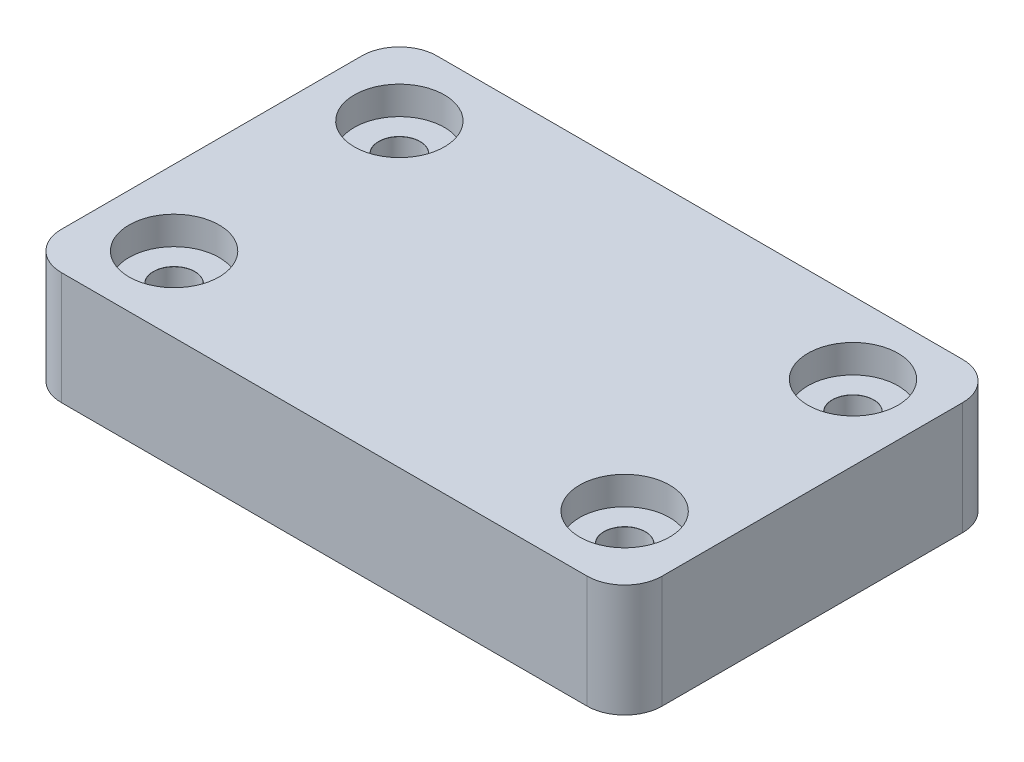
ISO-10303-21;
HEADER;
FILE_DESCRIPTION(('STEP AP214'),'2;1');
FILE_NAME('part.step','',(''),(''),'','','');
FILE_SCHEMA(('AUTOMOTIVE_DESIGN { 1 0 10303 214 1 1 1 1 }'));
ENDSEC;
DATA;
#1=APPLICATION_CONTEXT('core data for automotive mechanical design processes');
#2=APPLICATION_PROTOCOL_DEFINITION('international standard','automotive_design',2000,#1);
#3=PRODUCT_CONTEXT('',#1,'mechanical');
#4=PRODUCT('Part','Part','',(#3));
#5=PRODUCT_RELATED_PRODUCT_CATEGORY('part','',(#4));
#6=PRODUCT_DEFINITION_FORMATION('','',#4);
#7=PRODUCT_DEFINITION_CONTEXT('part definition',#1,'design');
#8=PRODUCT_DEFINITION('design','',#6,#7);
#9=PRODUCT_DEFINITION_SHAPE('','',#8);
#10=(LENGTH_UNIT() NAMED_UNIT(*) SI_UNIT(.MILLI.,.METRE.));
#11=(NAMED_UNIT(*) PLANE_ANGLE_UNIT() SI_UNIT($,.RADIAN.));
#12=(NAMED_UNIT(*) SI_UNIT($,.STERADIAN.) SOLID_ANGLE_UNIT());
#13=UNCERTAINTY_MEASURE_WITH_UNIT(LENGTH_MEASURE(1.E-05),#10,'distance_accuracy_value','');
#14=(GEOMETRIC_REPRESENTATION_CONTEXT(3) GLOBAL_UNCERTAINTY_ASSIGNED_CONTEXT((#13)) GLOBAL_UNIT_ASSIGNED_CONTEXT((#10,
#11,#12)) REPRESENTATION_CONTEXT('',''));
#15=CARTESIAN_POINT('',(0.,0.,0.));
#16=DIRECTION('',(0.,0.,1.));
#17=DIRECTION('',(1.,0.,0.));
#18=AXIS2_PLACEMENT_3D('',#15,#16,#17);
#19=CARTESIAN_POINT('',(-70.,30.,40.));
#20=DIRECTION('',(0.,-1.,0.));
#21=DIRECTION('',(0.,0.,-1.));
#22=AXIS2_PLACEMENT_3D('',#19,#20,#21);
#23=CYLINDRICAL_SURFACE('',#22,10.);
#24=CARTESIAN_POINT('',(-70.,0.,40.));
#25=DIRECTION('',(0.,1.,0.));
#26=DIRECTION('',(0.,0.,-1.));
#27=AXIS2_PLACEMENT_3D('',#24,#25,#26);
#28=CIRCLE('',#27,10.);
#29=CARTESIAN_POINT('',(-80.,0.,40.));
#30=VERTEX_POINT('',#29);
#31=CARTESIAN_POINT('',(-70.,0.,50.));
#32=VERTEX_POINT('',#31);
#33=EDGE_CURVE('E129',#30,#32,#28,.T.);
#34=ORIENTED_EDGE('',*,*,#33,.T.);
#35=DIRECTION('',(0.,-1.,0.));
#36=VECTOR('',#35,1.);
#37=CARTESIAN_POINT('',(-70.,30.,50.));
#38=LINE('',#37,#36);
#39=CARTESIAN_POINT('',(-70.,30.,50.));
#40=VERTEX_POINT('',#39);
#41=EDGE_CURVE('E11',#40,#32,#38,.T.);
#42=ORIENTED_EDGE('',*,*,#41,.F.);
#43=CARTESIAN_POINT('',(-70.,30.,40.));
#44=DIRECTION('',(0.,1.,0.));
#45=DIRECTION('',(0.,0.,-1.));
#46=AXIS2_PLACEMENT_3D('',#43,#44,#45);
#47=CIRCLE('',#46,10.);
#48=CARTESIAN_POINT('',(-80.,30.,40.));
#49=VERTEX_POINT('',#48);
#50=EDGE_CURVE('E144',#49,#40,#47,.T.);
#51=ORIENTED_EDGE('',*,*,#50,.F.);
#52=DIRECTION('',(0.,-1.,0.));
#53=VECTOR('',#52,1.);
#54=CARTESIAN_POINT('',(-80.,30.,40.));
#55=LINE('',#54,#53);
#56=EDGE_CURVE('E125',#49,#30,#55,.T.);
#57=ORIENTED_EDGE('',*,*,#56,.T.);
#58=EDGE_LOOP('',(#34,#42,#51,#57));
#59=FACE_BOUND('',#58,.T.);
#60=ADVANCED_FACE('F33',(#59),#23,.T.);
#61=CARTESIAN_POINT('',(-70.,30.,50.));
#62=DIRECTION('',(0.,0.,-1.));
#63=DIRECTION('',(-1.,0.,0.));
#64=AXIS2_PLACEMENT_3D('',#61,#62,#63);
#65=PLANE('',#64);
#66=DIRECTION('',(1.,0.,0.));
#67=VECTOR('',#66,1.);
#68=CARTESIAN_POINT('',(-70.,0.,50.));
#69=LINE('',#68,#67);
#70=CARTESIAN_POINT('',(70.,0.,50.));
#71=VERTEX_POINT('',#70);
#72=EDGE_CURVE('E132',#32,#71,#69,.T.);
#73=ORIENTED_EDGE('',*,*,#72,.T.);
#74=DIRECTION('',(0.,-1.,0.));
#75=VECTOR('',#74,1.);
#76=CARTESIAN_POINT('',(70.,30.,50.));
#77=LINE('',#76,#75);
#78=CARTESIAN_POINT('',(70.,30.,50.));
#79=VERTEX_POINT('',#78);
#80=EDGE_CURVE('E41',#79,#71,#77,.T.);
#81=ORIENTED_EDGE('',*,*,#80,.F.);
#82=DIRECTION('',(1.,0.,0.));
#83=VECTOR('',#82,1.);
#84=CARTESIAN_POINT('',(-70.,30.,50.));
#85=LINE('',#84,#83);
#86=EDGE_CURVE('E92',#40,#79,#85,.T.);
#87=ORIENTED_EDGE('',*,*,#86,.F.);
#88=ORIENTED_EDGE('',*,*,#41,.T.);
#89=EDGE_LOOP('',(#73,#81,#87,#88));
#90=FACE_BOUND('',#89,.T.);
#91=ADVANCED_FACE('F310',(#90),#65,.F.);
#92=CARTESIAN_POINT('',(70.,30.,40.));
#93=DIRECTION('',(0.,-1.,0.));
#94=DIRECTION('',(0.,0.,-1.));
#95=AXIS2_PLACEMENT_3D('',#92,#93,#94);
#96=CYLINDRICAL_SURFACE('',#95,10.);
#97=CARTESIAN_POINT('',(70.,0.,40.));
#98=DIRECTION('',(0.,1.,0.));
#99=DIRECTION('',(0.,0.,-1.));
#100=AXIS2_PLACEMENT_3D('',#97,#98,#99);
#101=CIRCLE('',#100,10.);
#102=CARTESIAN_POINT('',(80.,0.,40.));
#103=VERTEX_POINT('',#102);
#104=EDGE_CURVE('E135',#71,#103,#101,.T.);
#105=ORIENTED_EDGE('',*,*,#104,.T.);
#106=DIRECTION('',(0.,-1.,0.));
#107=VECTOR('',#106,1.);
#108=CARTESIAN_POINT('',(80.,30.,40.));
#109=LINE('',#108,#107);
#110=CARTESIAN_POINT('',(80.,30.,40.));
#111=VERTEX_POINT('',#110);
#112=EDGE_CURVE('E151',#111,#103,#109,.T.);
#113=ORIENTED_EDGE('',*,*,#112,.F.);
#114=CARTESIAN_POINT('',(70.,30.,40.));
#115=DIRECTION('',(0.,1.,0.));
#116=DIRECTION('',(0.,0.,-1.));
#117=AXIS2_PLACEMENT_3D('',#114,#115,#116);
#118=CIRCLE('',#117,10.);
#119=EDGE_CURVE('E159',#79,#111,#118,.T.);
#120=ORIENTED_EDGE('',*,*,#119,.F.);
#121=ORIENTED_EDGE('',*,*,#80,.T.);
#122=EDGE_LOOP('',(#105,#113,#120,#121));
#123=FACE_BOUND('',#122,.T.);
#124=ADVANCED_FACE('F157',(#123),#96,.T.);
#125=CARTESIAN_POINT('',(80.,30.,40.));
#126=DIRECTION('',(-1.,0.,0.));
#127=DIRECTION('',(0.,0.,1.));
#128=AXIS2_PLACEMENT_3D('',#125,#126,#127);
#129=PLANE('',#128);
#130=DIRECTION('',(0.,0.,-1.));
#131=VECTOR('',#130,1.);
#132=CARTESIAN_POINT('',(80.,0.,40.));
#133=LINE('',#132,#131);
#134=CARTESIAN_POINT('',(80.,0.,-40.));
#135=VERTEX_POINT('',#134);
#136=EDGE_CURVE('E137',#103,#135,#133,.T.);
#137=ORIENTED_EDGE('',*,*,#136,.T.);
#138=DIRECTION('',(0.,-1.,0.));
#139=VECTOR('',#138,1.);
#140=CARTESIAN_POINT('',(80.,30.,-40.));
#141=LINE('',#140,#139);
#142=CARTESIAN_POINT('',(80.,30.,-40.));
#143=VERTEX_POINT('',#142);
#144=EDGE_CURVE('E148',#143,#135,#141,.T.);
#145=ORIENTED_EDGE('',*,*,#144,.F.);
#146=DIRECTION('',(0.,0.,-1.));
#147=VECTOR('',#146,1.);
#148=CARTESIAN_POINT('',(80.,30.,40.));
#149=LINE('',#148,#147);
#150=EDGE_CURVE('E171',#111,#143,#149,.T.);
#151=ORIENTED_EDGE('',*,*,#150,.F.);
#152=ORIENTED_EDGE('',*,*,#112,.T.);
#153=EDGE_LOOP('',(#137,#145,#151,#152));
#154=FACE_BOUND('',#153,.T.);
#155=ADVANCED_FACE('F167',(#154),#129,.F.);
#156=CARTESIAN_POINT('',(70.,30.,-40.));
#157=DIRECTION('',(0.,-1.,0.));
#158=DIRECTION('',(0.,0.,-1.));
#159=AXIS2_PLACEMENT_3D('',#156,#157,#158);
#160=CYLINDRICAL_SURFACE('',#159,9.99999999999999);
#161=CARTESIAN_POINT('',(70.,0.,-40.));
#162=DIRECTION('',(0.,1.,0.));
#163=DIRECTION('',(0.,0.,-1.));
#164=AXIS2_PLACEMENT_3D('',#161,#162,#163);
#165=CIRCLE('',#164,9.99999999999999);
#166=CARTESIAN_POINT('',(70.,0.,-50.));
#167=VERTEX_POINT('',#166);
#168=EDGE_CURVE('E139',#135,#167,#165,.T.);
#169=ORIENTED_EDGE('',*,*,#168,.T.);
#170=DIRECTION('',(0.,-1.,0.));
#171=VECTOR('',#170,1.);
#172=CARTESIAN_POINT('',(70.,30.,-50.));
#173=LINE('',#172,#171);
#174=CARTESIAN_POINT('',(70.,30.,-50.));
#175=VERTEX_POINT('',#174);
#176=EDGE_CURVE('E120',#175,#167,#173,.T.);
#177=ORIENTED_EDGE('',*,*,#176,.F.);
#178=CARTESIAN_POINT('',(70.,30.,-40.));
#179=DIRECTION('',(0.,1.,0.));
#180=DIRECTION('',(0.,0.,-1.));
#181=AXIS2_PLACEMENT_3D('',#178,#179,#180);
#182=CIRCLE('',#181,9.99999999999999);
#183=EDGE_CURVE('E111',#143,#175,#182,.T.);
#184=ORIENTED_EDGE('',*,*,#183,.F.);
#185=ORIENTED_EDGE('',*,*,#144,.T.);
#186=EDGE_LOOP('',(#169,#177,#184,#185));
#187=FACE_BOUND('',#186,.T.);
#188=ADVANCED_FACE('F170',(#187),#160,.T.);
#189=CARTESIAN_POINT('',(-70.,30.,-50.));
#190=DIRECTION('',(0.,0.,1.));
#191=DIRECTION('',(1.,0.,0.));
#192=AXIS2_PLACEMENT_3D('',#189,#190,#191);
#193=PLANE('',#192);
#194=DIRECTION('',(-1.,0.,0.));
#195=VECTOR('',#194,1.);
#196=CARTESIAN_POINT('',(-70.,0.,-50.));
#197=LINE('',#196,#195);
#198=CARTESIAN_POINT('',(-70.,0.,-50.));
#199=VERTEX_POINT('',#198);
#200=EDGE_CURVE('E119',#167,#199,#197,.T.);
#201=ORIENTED_EDGE('',*,*,#200,.T.);
#202=DIRECTION('',(0.,-1.,0.));
#203=VECTOR('',#202,1.);
#204=CARTESIAN_POINT('',(-70.,30.,-50.));
#205=LINE('',#204,#203);
#206=CARTESIAN_POINT('',(-70.,30.,-50.));
#207=VERTEX_POINT('',#206);
#208=EDGE_CURVE('E116',#207,#199,#205,.T.);
#209=ORIENTED_EDGE('',*,*,#208,.F.);
#210=DIRECTION('',(-1.,0.,0.));
#211=VECTOR('',#210,1.);
#212=CARTESIAN_POINT('',(-70.,30.,-50.));
#213=LINE('',#212,#211);
#214=EDGE_CURVE('E105',#175,#207,#213,.T.);
#215=ORIENTED_EDGE('',*,*,#214,.F.);
#216=ORIENTED_EDGE('',*,*,#176,.T.);
#217=EDGE_LOOP('',(#201,#209,#215,#216));
#218=FACE_BOUND('',#217,.T.);
#219=ADVANCED_FACE('F117',(#218),#193,.F.);
#220=CARTESIAN_POINT('',(-70.,30.,-40.));
#221=DIRECTION('',(0.,-1.,0.));
#222=DIRECTION('',(0.,0.,-1.));
#223=AXIS2_PLACEMENT_3D('',#220,#221,#222);
#224=CYLINDRICAL_SURFACE('',#223,10.);
#225=CARTESIAN_POINT('',(-70.,0.,-40.));
#226=DIRECTION('',(0.,1.,0.));
#227=DIRECTION('',(0.,0.,-1.));
#228=AXIS2_PLACEMENT_3D('',#225,#226,#227);
#229=CIRCLE('',#228,10.);
#230=CARTESIAN_POINT('',(-80.,0.,-40.));
#231=VERTEX_POINT('',#230);
#232=EDGE_CURVE('E78',#199,#231,#229,.T.);
#233=ORIENTED_EDGE('',*,*,#232,.T.);
#234=DIRECTION('',(0.,-1.,0.));
#235=VECTOR('',#234,1.);
#236=CARTESIAN_POINT('',(-80.,30.,-40.));
#237=LINE('',#236,#235);
#238=CARTESIAN_POINT('',(-80.,30.,-40.));
#239=VERTEX_POINT('',#238);
#240=EDGE_CURVE('E121',#239,#231,#237,.T.);
#241=ORIENTED_EDGE('',*,*,#240,.F.);
#242=CARTESIAN_POINT('',(-70.,30.,-40.));
#243=DIRECTION('',(0.,1.,0.));
#244=DIRECTION('',(0.,0.,-1.));
#245=AXIS2_PLACEMENT_3D('',#242,#243,#244);
#246=CIRCLE('',#245,10.);
#247=EDGE_CURVE('E109',#207,#239,#246,.T.);
#248=ORIENTED_EDGE('',*,*,#247,.F.);
#249=ORIENTED_EDGE('',*,*,#208,.T.);
#250=EDGE_LOOP('',(#233,#241,#248,#249));
#251=FACE_BOUND('',#250,.T.);
#252=ADVANCED_FACE('F123',(#251),#224,.T.);
#253=CARTESIAN_POINT('',(-80.,30.,40.));
#254=DIRECTION('',(1.,0.,0.));
#255=DIRECTION('',(0.,0.,-1.));
#256=AXIS2_PLACEMENT_3D('',#253,#254,#255);
#257=PLANE('',#256);
#258=DIRECTION('',(0.,0.,1.));
#259=VECTOR('',#258,1.);
#260=CARTESIAN_POINT('',(-80.,0.,40.));
#261=LINE('',#260,#259);
#262=EDGE_CURVE('E84',#231,#30,#261,.T.);
#263=ORIENTED_EDGE('',*,*,#262,.T.);
#264=ORIENTED_EDGE('',*,*,#56,.F.);
#265=DIRECTION('',(0.,0.,1.));
#266=VECTOR('',#265,1.);
#267=CARTESIAN_POINT('',(-80.,30.,40.));
#268=LINE('',#267,#266);
#269=EDGE_CURVE('E49',#239,#49,#268,.T.);
#270=ORIENTED_EDGE('',*,*,#269,.F.);
#271=ORIENTED_EDGE('',*,*,#240,.T.);
#272=EDGE_LOOP('',(#263,#264,#270,#271));
#273=FACE_BOUND('',#272,.T.);
#274=ADVANCED_FACE('F284',(#273),#257,.F.);
#275=CARTESIAN_POINT('',(-70.,30.,40.));
#276=DIRECTION('',(0.,-1.,0.));
#277=DIRECTION('',(0.,0.,-1.));
#278=AXIS2_PLACEMENT_3D('',#275,#276,#277);
#279=PLANE('',#278);
#280=CARTESIAN_POINT('',(-60.,30.,-30.));
#281=DIRECTION('',(0.,1.,0.));
#282=DIRECTION('',(0.,0.,1.));
#283=AXIS2_PLACEMENT_3D('',#280,#281,#282);
#284=CIRCLE('',#283,12.);
#285=CARTESIAN_POINT('',(-60.,30.,-18.));
#286=VERTEX_POINT('',#285);
#287=EDGE_CURVE('E242',#286,#286,#284,.T.);
#288=ORIENTED_EDGE('',*,*,#287,.F.);
#289=EDGE_LOOP('',(#288));
#290=FACE_BOUND('',#289,.T.);
#291=CARTESIAN_POINT('',(60.,30.,-30.8173689432465));
#292=DIRECTION('',(0.,1.,0.));
#293=DIRECTION('',(0.,0.,1.));
#294=AXIS2_PLACEMENT_3D('',#291,#292,#293);
#295=CIRCLE('',#294,12.);
#296=CARTESIAN_POINT('',(60.,30.,-18.8173689432465));
#297=VERTEX_POINT('',#296);
#298=EDGE_CURVE('E224',#297,#297,#295,.T.);
#299=ORIENTED_EDGE('',*,*,#298,.F.);
#300=EDGE_LOOP('',(#299));
#301=FACE_BOUND('',#300,.T.);
#302=CARTESIAN_POINT('',(-60.,30.,30.));
#303=DIRECTION('',(0.,1.,0.));
#304=DIRECTION('',(0.,0.,1.));
#305=AXIS2_PLACEMENT_3D('',#302,#303,#304);
#306=CIRCLE('',#305,12.);
#307=CARTESIAN_POINT('',(-60.,30.,42.));
#308=VERTEX_POINT('',#307);
#309=EDGE_CURVE('E206',#308,#308,#306,.T.);
#310=ORIENTED_EDGE('',*,*,#309,.F.);
#311=EDGE_LOOP('',(#310));
#312=FACE_BOUND('',#311,.T.);
#313=CARTESIAN_POINT('',(60.,30.,30.));
#314=DIRECTION('',(0.,1.,0.));
#315=DIRECTION('',(0.,0.,1.));
#316=AXIS2_PLACEMENT_3D('',#313,#314,#315);
#317=CIRCLE('',#316,12.);
#318=CARTESIAN_POINT('',(60.,30.,42.));
#319=VERTEX_POINT('',#318);
#320=EDGE_CURVE('E188',#319,#319,#317,.T.);
#321=ORIENTED_EDGE('',*,*,#320,.F.);
#322=EDGE_LOOP('',(#321));
#323=FACE_BOUND('',#322,.T.);
#324=ORIENTED_EDGE('',*,*,#50,.T.);
#325=ORIENTED_EDGE('',*,*,#86,.T.);
#326=ORIENTED_EDGE('',*,*,#119,.T.);
#327=ORIENTED_EDGE('',*,*,#150,.T.);
#328=ORIENTED_EDGE('',*,*,#183,.T.);
#329=ORIENTED_EDGE('',*,*,#214,.T.);
#330=ORIENTED_EDGE('',*,*,#247,.T.);
#331=ORIENTED_EDGE('',*,*,#269,.T.);
#332=EDGE_LOOP('',(#324,#325,#326,#327,#328,#329,#330,#331));
#333=FACE_BOUND('',#332,.T.);
#334=ADVANCED_FACE('F107',(#290,#301,#312,#323,#333),#279,.F.);
#335=CARTESIAN_POINT('',(-70.,0.,40.));
#336=DIRECTION('',(0.,-1.,0.));
#337=DIRECTION('',(0.,0.,-1.));
#338=AXIS2_PLACEMENT_3D('',#335,#336,#337);
#339=PLANE('',#338);
#340=CARTESIAN_POINT('',(-60.,0.,-30.));
#341=DIRECTION('',(0.,1.,0.));
#342=DIRECTION('',(0.,0.,1.));
#343=AXIS2_PLACEMENT_3D('',#340,#341,#342);
#344=CIRCLE('',#343,5.525);
#345=CARTESIAN_POINT('',(-60.,0.,-24.475));
#346=VERTEX_POINT('',#345);
#347=EDGE_CURVE('E245',#346,#346,#344,.T.);
#348=ORIENTED_EDGE('',*,*,#347,.T.);
#349=EDGE_LOOP('',(#348));
#350=FACE_BOUND('',#349,.T.);
#351=CARTESIAN_POINT('',(60.,0.,-30.8173689432465));
#352=DIRECTION('',(0.,1.,0.));
#353=DIRECTION('',(0.,0.,1.));
#354=AXIS2_PLACEMENT_3D('',#351,#352,#353);
#355=CIRCLE('',#354,5.52499999999999);
#356=CARTESIAN_POINT('',(60.,0.,-25.2923689432465));
#357=VERTEX_POINT('',#356);
#358=EDGE_CURVE('E227',#357,#357,#355,.T.);
#359=ORIENTED_EDGE('',*,*,#358,.T.);
#360=EDGE_LOOP('',(#359));
#361=FACE_BOUND('',#360,.T.);
#362=CARTESIAN_POINT('',(-60.,0.,30.));
#363=DIRECTION('',(0.,1.,0.));
#364=DIRECTION('',(0.,0.,1.));
#365=AXIS2_PLACEMENT_3D('',#362,#363,#364);
#366=CIRCLE('',#365,5.525);
#367=CARTESIAN_POINT('',(-60.,0.,35.525));
#368=VERTEX_POINT('',#367);
#369=EDGE_CURVE('E209',#368,#368,#366,.T.);
#370=ORIENTED_EDGE('',*,*,#369,.T.);
#371=EDGE_LOOP('',(#370));
#372=FACE_BOUND('',#371,.T.);
#373=CARTESIAN_POINT('',(60.,0.,30.));
#374=DIRECTION('',(0.,1.,0.));
#375=DIRECTION('',(0.,0.,1.));
#376=AXIS2_PLACEMENT_3D('',#373,#374,#375);
#377=CIRCLE('',#376,5.525);
#378=CARTESIAN_POINT('',(60.,0.,35.525));
#379=VERTEX_POINT('',#378);
#380=EDGE_CURVE('E191',#379,#379,#377,.T.);
#381=ORIENTED_EDGE('',*,*,#380,.T.);
#382=EDGE_LOOP('',(#381));
#383=FACE_BOUND('',#382,.T.);
#384=ORIENTED_EDGE('',*,*,#33,.F.);
#385=ORIENTED_EDGE('',*,*,#262,.F.);
#386=ORIENTED_EDGE('',*,*,#232,.F.);
#387=ORIENTED_EDGE('',*,*,#200,.F.);
#388=ORIENTED_EDGE('',*,*,#168,.F.);
#389=ORIENTED_EDGE('',*,*,#136,.F.);
#390=ORIENTED_EDGE('',*,*,#104,.F.);
#391=ORIENTED_EDGE('',*,*,#72,.F.);
#392=EDGE_LOOP('',(#384,#385,#386,#387,#388,#389,#390,#391));
#393=FACE_BOUND('',#392,.T.);
#394=ADVANCED_FACE('F163',(#350,#361,#372,#383,#393),#339,.T.);
#395=CARTESIAN_POINT('',(60.,0.0250000000000007,30.));
#396=DIRECTION('',(0.,-1.,0.));
#397=DIRECTION('',(0.,0.,-1.));
#398=AXIS2_PLACEMENT_3D('',#395,#396,#397);
#399=CONICAL_SURFACE('',#398,5.5,0.785398163397379);
#400=ORIENTED_EDGE('',*,*,#380,.F.);
#401=EDGE_LOOP('',(#400));
#402=FACE_BOUND('',#401,.T.);
#403=CARTESIAN_POINT('',(60.,0.0250000000000007,30.));
#404=DIRECTION('',(0.,1.,0.));
#405=DIRECTION('',(0.,0.,1.));
#406=AXIS2_PLACEMENT_3D('',#403,#404,#405);
#407=CIRCLE('',#406,5.5);
#408=CARTESIAN_POINT('',(60.,0.0250000000000007,35.5));
#409=VERTEX_POINT('',#408);
#410=EDGE_CURVE('E133',#409,#409,#407,.T.);
#411=ORIENTED_EDGE('',*,*,#410,.T.);
#412=EDGE_LOOP('',(#411));
#413=FACE_BOUND('',#412,.T.);
#414=ADVANCED_FACE('F371',(#402,#413),#399,.F.);
#415=CARTESIAN_POINT('',(60.,30.,30.));
#416=DIRECTION('',(0.,1.,0.));
#417=DIRECTION('',(0.,0.,1.));
#418=AXIS2_PLACEMENT_3D('',#415,#416,#417);
#419=CYLINDRICAL_SURFACE('',#418,5.5);
#420=ORIENTED_EDGE('',*,*,#410,.F.);
#421=EDGE_LOOP('',(#420));
#422=FACE_BOUND('',#421,.T.);
#423=CARTESIAN_POINT('',(60.,22.475,30.));
#424=DIRECTION('',(0.,1.,0.));
#425=DIRECTION('',(0.,0.,1.));
#426=AXIS2_PLACEMENT_3D('',#423,#424,#425);
#427=CIRCLE('',#426,5.5);
#428=CARTESIAN_POINT('',(60.,22.475,35.5));
#429=VERTEX_POINT('',#428);
#430=EDGE_CURVE('E179',#429,#429,#427,.T.);
#431=ORIENTED_EDGE('',*,*,#430,.T.);
#432=EDGE_LOOP('',(#431));
#433=FACE_BOUND('',#432,.T.);
#434=ADVANCED_FACE('F379',(#422,#433),#419,.F.);
#435=CARTESIAN_POINT('',(60.,22.5,30.));
#436=DIRECTION('',(0.,1.,0.));
#437=DIRECTION('',(0.,0.,1.));
#438=AXIS2_PLACEMENT_3D('',#435,#436,#437);
#439=CONICAL_SURFACE('',#438,5.525,0.785398163397448);
#440=ORIENTED_EDGE('',*,*,#430,.F.);
#441=EDGE_LOOP('',(#440));
#442=FACE_BOUND('',#441,.T.);
#443=CARTESIAN_POINT('',(60.,22.5,30.));
#444=DIRECTION('',(0.,1.,0.));
#445=DIRECTION('',(0.,0.,1.));
#446=AXIS2_PLACEMENT_3D('',#443,#444,#445);
#447=CIRCLE('',#446,5.525);
#448=CARTESIAN_POINT('',(60.,22.5,35.525));
#449=VERTEX_POINT('',#448);
#450=EDGE_CURVE('E182',#449,#449,#447,.T.);
#451=ORIENTED_EDGE('',*,*,#450,.T.);
#452=EDGE_LOOP('',(#451));
#453=FACE_BOUND('',#452,.T.);
#454=ADVANCED_FACE('F305',(#442,#453),#439,.F.);
#455=CARTESIAN_POINT('',(65.525,22.5,30.));
#456=DIRECTION('',(0.,-1.,0.));
#457=DIRECTION('',(0.,0.,-1.));
#458=AXIS2_PLACEMENT_3D('',#455,#456,#457);
#459=PLANE('',#458);
#460=ORIENTED_EDGE('',*,*,#450,.F.);
#461=EDGE_LOOP('',(#460));
#462=FACE_BOUND('',#461,.T.);
#463=CARTESIAN_POINT('',(60.,22.5,30.));
#464=DIRECTION('',(0.,1.,0.));
#465=DIRECTION('',(0.,0.,1.));
#466=AXIS2_PLACEMENT_3D('',#463,#464,#465);
#467=CIRCLE('',#466,12.);
#468=CARTESIAN_POINT('',(60.,22.5,42.));
#469=VERTEX_POINT('',#468);
#470=EDGE_CURVE('E185',#469,#469,#467,.T.);
#471=ORIENTED_EDGE('',*,*,#470,.T.);
#472=EDGE_LOOP('',(#471));
#473=FACE_BOUND('',#472,.T.);
#474=ADVANCED_FACE('F295',(#462,#473),#459,.F.);
#475=CARTESIAN_POINT('',(60.,30.,30.));
#476=DIRECTION('',(0.,1.,0.));
#477=DIRECTION('',(0.,0.,1.));
#478=AXIS2_PLACEMENT_3D('',#475,#476,#477);
#479=CYLINDRICAL_SURFACE('',#478,12.);
#480=ORIENTED_EDGE('',*,*,#470,.F.);
#481=EDGE_LOOP('',(#480));
#482=FACE_BOUND('',#481,.T.);
#483=ORIENTED_EDGE('',*,*,#320,.T.);
#484=EDGE_LOOP('',(#483));
#485=FACE_BOUND('',#484,.T.);
#486=ADVANCED_FACE('F292',(#482,#485),#479,.F.);
#487=CARTESIAN_POINT('',(-60.,0.0250000000000007,30.));
#488=DIRECTION('',(0.,-1.,0.));
#489=DIRECTION('',(0.,0.,-1.));
#490=AXIS2_PLACEMENT_3D('',#487,#488,#489);
#491=CONICAL_SURFACE('',#490,5.49999999999999,0.785398163397518);
#492=ORIENTED_EDGE('',*,*,#369,.F.);
#493=EDGE_LOOP('',(#492));
#494=FACE_BOUND('',#493,.T.);
#495=CARTESIAN_POINT('',(-60.,0.0250000000000007,30.));
#496=DIRECTION('',(0.,1.,0.));
#497=DIRECTION('',(0.,0.,1.));
#498=AXIS2_PLACEMENT_3D('',#495,#496,#497);
#499=CIRCLE('',#498,5.49999999999999);
#500=CARTESIAN_POINT('',(-60.,0.0250000000000007,35.5));
#501=VERTEX_POINT('',#500);
#502=EDGE_CURVE('E194',#501,#501,#499,.T.);
#503=ORIENTED_EDGE('',*,*,#502,.T.);
#504=EDGE_LOOP('',(#503));
#505=FACE_BOUND('',#504,.T.);
#506=ADVANCED_FACE('F294',(#494,#505),#491,.F.);
#507=CARTESIAN_POINT('',(-60.,30.,30.));
#508=DIRECTION('',(0.,1.,0.));
#509=DIRECTION('',(0.,0.,1.));
#510=AXIS2_PLACEMENT_3D('',#507,#508,#509);
#511=CYLINDRICAL_SURFACE('',#510,5.49999999999999);
#512=ORIENTED_EDGE('',*,*,#502,.F.);
#513=EDGE_LOOP('',(#512));
#514=FACE_BOUND('',#513,.T.);
#515=CARTESIAN_POINT('',(-60.,22.475,30.));
#516=DIRECTION('',(0.,1.,0.));
#517=DIRECTION('',(0.,0.,1.));
#518=AXIS2_PLACEMENT_3D('',#515,#516,#517);
#519=CIRCLE('',#518,5.5);
#520=CARTESIAN_POINT('',(-60.,22.475,35.5));
#521=VERTEX_POINT('',#520);
#522=EDGE_CURVE('E197',#521,#521,#519,.T.);
#523=ORIENTED_EDGE('',*,*,#522,.T.);
#524=EDGE_LOOP('',(#523));
#525=FACE_BOUND('',#524,.T.);
#526=ADVANCED_FACE('F302',(#514,#525),#511,.F.);
#527=CARTESIAN_POINT('',(-60.,22.5,30.));
#528=DIRECTION('',(0.,1.,0.));
#529=DIRECTION('',(0.,0.,1.));
#530=AXIS2_PLACEMENT_3D('',#527,#528,#529);
#531=CONICAL_SURFACE('',#530,5.525,0.785398163397448);
#532=ORIENTED_EDGE('',*,*,#522,.F.);
#533=EDGE_LOOP('',(#532));
#534=FACE_BOUND('',#533,.T.);
#535=CARTESIAN_POINT('',(-60.,22.5,30.));
#536=DIRECTION('',(0.,1.,0.));
#537=DIRECTION('',(0.,0.,1.));
#538=AXIS2_PLACEMENT_3D('',#535,#536,#537);
#539=CIRCLE('',#538,5.525);
#540=CARTESIAN_POINT('',(-60.,22.5,35.525));
#541=VERTEX_POINT('',#540);
#542=EDGE_CURVE('E200',#541,#541,#539,.T.);
#543=ORIENTED_EDGE('',*,*,#542,.T.);
#544=EDGE_LOOP('',(#543));
#545=FACE_BOUND('',#544,.T.);
#546=ADVANCED_FACE('F423',(#534,#545),#531,.F.);
#547=CARTESIAN_POINT('',(-54.475,22.5,30.));
#548=DIRECTION('',(0.,-1.,0.));
#549=DIRECTION('',(0.,0.,-1.));
#550=AXIS2_PLACEMENT_3D('',#547,#548,#549);
#551=PLANE('',#550);
#552=ORIENTED_EDGE('',*,*,#542,.F.);
#553=EDGE_LOOP('',(#552));
#554=FACE_BOUND('',#553,.T.);
#555=CARTESIAN_POINT('',(-60.,22.5,30.));
#556=DIRECTION('',(0.,1.,0.));
#557=DIRECTION('',(0.,0.,1.));
#558=AXIS2_PLACEMENT_3D('',#555,#556,#557);
#559=CIRCLE('',#558,12.);
#560=CARTESIAN_POINT('',(-60.,22.5,42.));
#561=VERTEX_POINT('',#560);
#562=EDGE_CURVE('E203',#561,#561,#559,.T.);
#563=ORIENTED_EDGE('',*,*,#562,.T.);
#564=EDGE_LOOP('',(#563));
#565=FACE_BOUND('',#564,.T.);
#566=ADVANCED_FACE('F433',(#554,#565),#551,.F.);
#567=CARTESIAN_POINT('',(-60.,30.,30.));
#568=DIRECTION('',(0.,1.,0.));
#569=DIRECTION('',(0.,0.,1.));
#570=AXIS2_PLACEMENT_3D('',#567,#568,#569);
#571=CYLINDRICAL_SURFACE('',#570,12.);
#572=ORIENTED_EDGE('',*,*,#562,.F.);
#573=EDGE_LOOP('',(#572));
#574=FACE_BOUND('',#573,.T.);
#575=ORIENTED_EDGE('',*,*,#309,.T.);
#576=EDGE_LOOP('',(#575));
#577=FACE_BOUND('',#576,.T.);
#578=ADVANCED_FACE('F443',(#574,#577),#571,.F.);
#579=CARTESIAN_POINT('',(60.,0.0250000000000007,-30.8173689432465));
#580=DIRECTION('',(0.,-1.,0.));
#581=DIRECTION('',(0.,0.,-1.));
#582=AXIS2_PLACEMENT_3D('',#579,#580,#581);
#583=CONICAL_SURFACE('',#582,5.49999999999999,0.785398163397379);
#584=ORIENTED_EDGE('',*,*,#358,.F.);
#585=EDGE_LOOP('',(#584));
#586=FACE_BOUND('',#585,.T.);
#587=CARTESIAN_POINT('',(60.,0.0250000000000007,-30.8173689432465));
#588=DIRECTION('',(0.,1.,0.));
#589=DIRECTION('',(0.,0.,1.));
#590=AXIS2_PLACEMENT_3D('',#587,#588,#589);
#591=CIRCLE('',#590,5.49999999999999);
#592=CARTESIAN_POINT('',(60.,0.0250000000000007,-25.3173689432465));
#593=VERTEX_POINT('',#592);
#594=EDGE_CURVE('E212',#593,#593,#591,.T.);
#595=ORIENTED_EDGE('',*,*,#594,.T.);
#596=EDGE_LOOP('',(#595));
#597=FACE_BOUND('',#596,.T.);
#598=ADVANCED_FACE('F453',(#586,#597),#583,.F.);
#599=CARTESIAN_POINT('',(60.,30.,-30.8173689432465));
#600=DIRECTION('',(0.,1.,0.));
#601=DIRECTION('',(0.,0.,1.));
#602=AXIS2_PLACEMENT_3D('',#599,#600,#601);
#603=CYLINDRICAL_SURFACE('',#602,5.5);
#604=ORIENTED_EDGE('',*,*,#594,.F.);
#605=EDGE_LOOP('',(#604));
#606=FACE_BOUND('',#605,.T.);
#607=CARTESIAN_POINT('',(60.,22.475,-30.8173689432465));
#608=DIRECTION('',(0.,1.,0.));
#609=DIRECTION('',(0.,0.,1.));
#610=AXIS2_PLACEMENT_3D('',#607,#608,#609);
#611=CIRCLE('',#610,5.50000000000001);
#612=CARTESIAN_POINT('',(60.,22.475,-25.3173689432465));
#613=VERTEX_POINT('',#612);
#614=EDGE_CURVE('E215',#613,#613,#611,.T.);
#615=ORIENTED_EDGE('',*,*,#614,.T.);
#616=EDGE_LOOP('',(#615));
#617=FACE_BOUND('',#616,.T.);
#618=ADVANCED_FACE('F463',(#606,#617),#603,.F.);
#619=CARTESIAN_POINT('',(60.,22.5,-30.8173689432465));
#620=DIRECTION('',(0.,1.,0.));
#621=DIRECTION('',(0.,0.,1.));
#622=AXIS2_PLACEMENT_3D('',#619,#620,#621);
#623=CONICAL_SURFACE('',#622,5.525,0.785398163397448);
#624=ORIENTED_EDGE('',*,*,#614,.F.);
#625=EDGE_LOOP('',(#624));
#626=FACE_BOUND('',#625,.T.);
#627=CARTESIAN_POINT('',(60.,22.5,-30.8173689432465));
#628=DIRECTION('',(0.,1.,0.));
#629=DIRECTION('',(0.,0.,1.));
#630=AXIS2_PLACEMENT_3D('',#627,#628,#629);
#631=CIRCLE('',#630,5.525);
#632=CARTESIAN_POINT('',(60.,22.5,-25.2923689432465));
#633=VERTEX_POINT('',#632);
#634=EDGE_CURVE('E218',#633,#633,#631,.T.);
#635=ORIENTED_EDGE('',*,*,#634,.T.);
#636=EDGE_LOOP('',(#635));
#637=FACE_BOUND('',#636,.T.);
#638=ADVANCED_FACE('F473',(#626,#637),#623,.F.);
#639=CARTESIAN_POINT('',(65.525,22.5,-30.8173689432465));
#640=DIRECTION('',(0.,-1.,0.));
#641=DIRECTION('',(0.,0.,-1.));
#642=AXIS2_PLACEMENT_3D('',#639,#640,#641);
#643=PLANE('',#642);
#644=ORIENTED_EDGE('',*,*,#634,.F.);
#645=EDGE_LOOP('',(#644));
#646=FACE_BOUND('',#645,.T.);
#647=CARTESIAN_POINT('',(60.,22.5,-30.8173689432465));
#648=DIRECTION('',(0.,1.,0.));
#649=DIRECTION('',(0.,0.,1.));
#650=AXIS2_PLACEMENT_3D('',#647,#648,#649);
#651=CIRCLE('',#650,12.);
#652=CARTESIAN_POINT('',(60.,22.5,-18.8173689432465));
#653=VERTEX_POINT('',#652);
#654=EDGE_CURVE('E221',#653,#653,#651,.T.);
#655=ORIENTED_EDGE('',*,*,#654,.T.);
#656=EDGE_LOOP('',(#655));
#657=FACE_BOUND('',#656,.T.);
#658=ADVANCED_FACE('F483',(#646,#657),#643,.F.);
#659=CARTESIAN_POINT('',(60.,30.,-30.8173689432465));
#660=DIRECTION('',(0.,1.,0.));
#661=DIRECTION('',(0.,0.,1.));
#662=AXIS2_PLACEMENT_3D('',#659,#660,#661);
#663=CYLINDRICAL_SURFACE('',#662,12.);
#664=ORIENTED_EDGE('',*,*,#654,.F.);
#665=EDGE_LOOP('',(#664));
#666=FACE_BOUND('',#665,.T.);
#667=ORIENTED_EDGE('',*,*,#298,.T.);
#668=EDGE_LOOP('',(#667));
#669=FACE_BOUND('',#668,.T.);
#670=ADVANCED_FACE('F255',(#666,#669),#663,.F.);
#671=CARTESIAN_POINT('',(-60.,0.0250000000000007,-30.));
#672=DIRECTION('',(0.,-1.,0.));
#673=DIRECTION('',(0.,0.,-1.));
#674=AXIS2_PLACEMENT_3D('',#671,#672,#673);
#675=CONICAL_SURFACE('',#674,5.49999999999999,0.785398163397518);
#676=ORIENTED_EDGE('',*,*,#347,.F.);
#677=EDGE_LOOP('',(#676));
#678=FACE_BOUND('',#677,.T.);
#679=CARTESIAN_POINT('',(-60.,0.0250000000000007,-30.));
#680=DIRECTION('',(0.,1.,0.));
#681=DIRECTION('',(0.,0.,1.));
#682=AXIS2_PLACEMENT_3D('',#679,#680,#681);
#683=CIRCLE('',#682,5.49999999999999);
#684=CARTESIAN_POINT('',(-60.,0.0250000000000007,-24.5));
#685=VERTEX_POINT('',#684);
#686=EDGE_CURVE('E230',#685,#685,#683,.T.);
#687=ORIENTED_EDGE('',*,*,#686,.T.);
#688=EDGE_LOOP('',(#687));
#689=FACE_BOUND('',#688,.T.);
#690=ADVANCED_FACE('F251',(#678,#689),#675,.F.);
#691=CARTESIAN_POINT('',(-60.,30.,-30.));
#692=DIRECTION('',(0.,1.,0.));
#693=DIRECTION('',(0.,0.,1.));
#694=AXIS2_PLACEMENT_3D('',#691,#692,#693);
#695=CYLINDRICAL_SURFACE('',#694,5.49999999999999);
#696=ORIENTED_EDGE('',*,*,#686,.F.);
#697=EDGE_LOOP('',(#696));
#698=FACE_BOUND('',#697,.T.);
#699=CARTESIAN_POINT('',(-60.,22.475,-30.));
#700=DIRECTION('',(0.,1.,0.));
#701=DIRECTION('',(0.,0.,1.));
#702=AXIS2_PLACEMENT_3D('',#699,#700,#701);
#703=CIRCLE('',#702,5.5);
#704=CARTESIAN_POINT('',(-60.,22.475,-24.5));
#705=VERTEX_POINT('',#704);
#706=EDGE_CURVE('E233',#705,#705,#703,.T.);
#707=ORIENTED_EDGE('',*,*,#706,.T.);
#708=EDGE_LOOP('',(#707));
#709=FACE_BOUND('',#708,.T.);
#710=ADVANCED_FACE('F254',(#698,#709),#695,.F.);
#711=CARTESIAN_POINT('',(-60.,22.5,-30.));
#712=DIRECTION('',(0.,1.,0.));
#713=DIRECTION('',(0.,0.,1.));
#714=AXIS2_PLACEMENT_3D('',#711,#712,#713);
#715=CONICAL_SURFACE('',#714,5.525,0.785398163397587);
#716=ORIENTED_EDGE('',*,*,#706,.F.);
#717=EDGE_LOOP('',(#716));
#718=FACE_BOUND('',#717,.T.);
#719=CARTESIAN_POINT('',(-60.,22.5,-30.));
#720=DIRECTION('',(0.,1.,0.));
#721=DIRECTION('',(0.,0.,1.));
#722=AXIS2_PLACEMENT_3D('',#719,#720,#721);
#723=CIRCLE('',#722,5.525);
#724=CARTESIAN_POINT('',(-60.,22.5,-24.475));
#725=VERTEX_POINT('',#724);
#726=EDGE_CURVE('E236',#725,#725,#723,.T.);
#727=ORIENTED_EDGE('',*,*,#726,.T.);
#728=EDGE_LOOP('',(#727));
#729=FACE_BOUND('',#728,.T.);
#730=ADVANCED_FACE('F261',(#718,#729),#715,.F.);
#731=CARTESIAN_POINT('',(-54.475,22.5,-30.));
#732=DIRECTION('',(0.,-1.,0.));
#733=DIRECTION('',(0.,0.,-1.));
#734=AXIS2_PLACEMENT_3D('',#731,#732,#733);
#735=PLANE('',#734);
#736=ORIENTED_EDGE('',*,*,#726,.F.);
#737=EDGE_LOOP('',(#736));
#738=FACE_BOUND('',#737,.T.);
#739=CARTESIAN_POINT('',(-60.,22.5,-30.));
#740=DIRECTION('',(0.,1.,0.));
#741=DIRECTION('',(0.,0.,1.));
#742=AXIS2_PLACEMENT_3D('',#739,#740,#741);
#743=CIRCLE('',#742,12.);
#744=CARTESIAN_POINT('',(-60.,22.5,-18.));
#745=VERTEX_POINT('',#744);
#746=EDGE_CURVE('E239',#745,#745,#743,.T.);
#747=ORIENTED_EDGE('',*,*,#746,.T.);
#748=EDGE_LOOP('',(#747));
#749=FACE_BOUND('',#748,.T.);
#750=ADVANCED_FACE('F267',(#738,#749),#735,.F.);
#751=CARTESIAN_POINT('',(-60.,30.,-30.));
#752=DIRECTION('',(0.,1.,0.));
#753=DIRECTION('',(0.,0.,1.));
#754=AXIS2_PLACEMENT_3D('',#751,#752,#753);
#755=CYLINDRICAL_SURFACE('',#754,12.);
#756=ORIENTED_EDGE('',*,*,#746,.F.);
#757=EDGE_LOOP('',(#756));
#758=FACE_BOUND('',#757,.T.);
#759=ORIENTED_EDGE('',*,*,#287,.T.);
#760=EDGE_LOOP('',(#759));
#761=FACE_BOUND('',#760,.T.);
#762=ADVANCED_FACE('F273',(#758,#761),#755,.F.);
#763=CLOSED_SHELL('',(#60,#91,#124,#155,#188,#219,#252,#274,#334,#394,#414,#434,#454,#474,#486,
#506,#526,#546,#566,#578,#598,#618,#638,#658,#670,#690,#710,#730,#750,#762));
#764=MANIFOLD_SOLID_BREP('B2',#763);
#765=ADVANCED_BREP_SHAPE_REPRESENTATION('',(#18,#764),#14);
#766=SHAPE_DEFINITION_REPRESENTATION(#9,#765);
ENDSEC;
END-ISO-10303-21;
